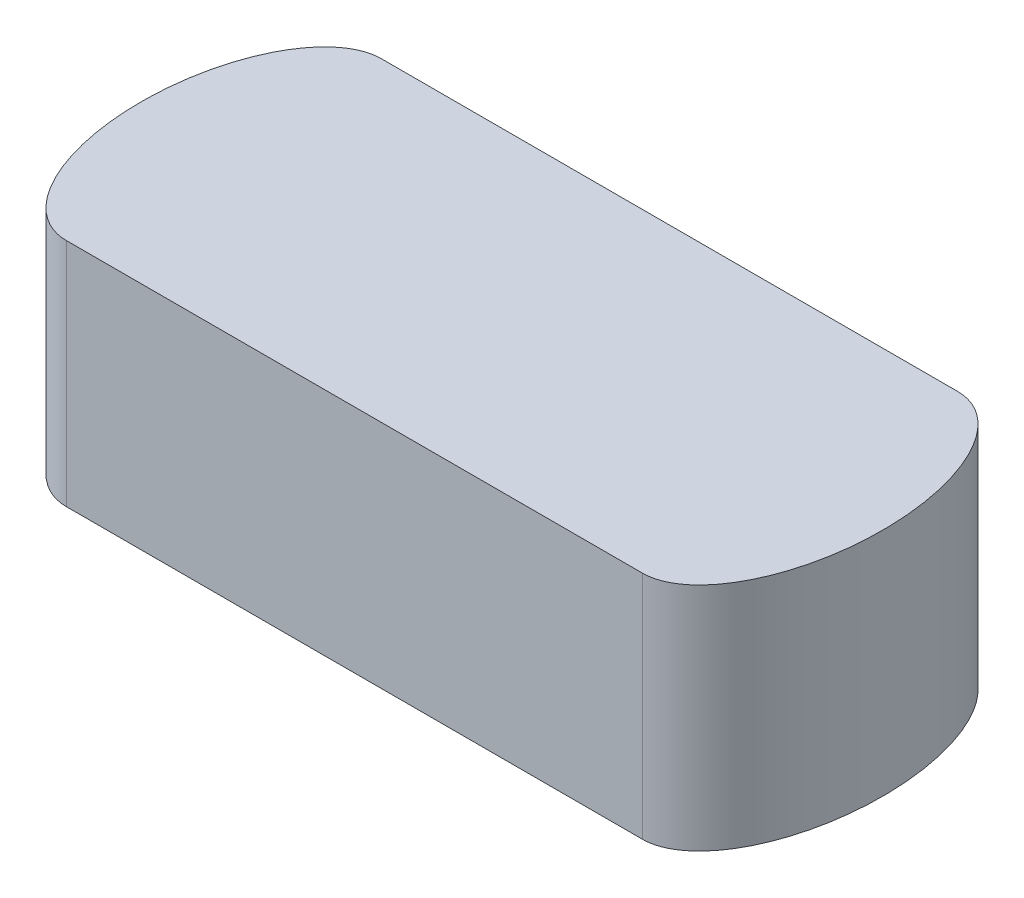
ISO-10303-21;
HEADER;
FILE_DESCRIPTION(('STEP AP214'),'2;1');
FILE_NAME('part.step','',(''),(''),'','','');
FILE_SCHEMA(('AUTOMOTIVE_DESIGN { 1 0 10303 214 1 1 1 1 }'));
ENDSEC;
DATA;
#1=APPLICATION_CONTEXT('core data for automotive mechanical design processes');
#2=APPLICATION_PROTOCOL_DEFINITION('international standard','automotive_design',2000,#1);
#3=PRODUCT_CONTEXT('',#1,'mechanical');
#4=PRODUCT('Part','Part','',(#3));
#5=PRODUCT_RELATED_PRODUCT_CATEGORY('part','',(#4));
#6=PRODUCT_DEFINITION_FORMATION('','',#4);
#7=PRODUCT_DEFINITION_CONTEXT('part definition',#1,'design');
#8=PRODUCT_DEFINITION('design','',#6,#7);
#9=PRODUCT_DEFINITION_SHAPE('','',#8);
#10=(LENGTH_UNIT() NAMED_UNIT(*) SI_UNIT(.MILLI.,.METRE.));
#11=(NAMED_UNIT(*) PLANE_ANGLE_UNIT() SI_UNIT($,.RADIAN.));
#12=(NAMED_UNIT(*) SI_UNIT($,.STERADIAN.) SOLID_ANGLE_UNIT());
#13=UNCERTAINTY_MEASURE_WITH_UNIT(LENGTH_MEASURE(1.E-05),#10,'distance_accuracy_value','');
#14=(GEOMETRIC_REPRESENTATION_CONTEXT(3) GLOBAL_UNCERTAINTY_ASSIGNED_CONTEXT((#13)) GLOBAL_UNIT_ASSIGNED_CONTEXT((#10,
#11,#12)) REPRESENTATION_CONTEXT('',''));
#15=CARTESIAN_POINT('',(0.,0.,0.));
#16=DIRECTION('',(0.,0.,1.));
#17=DIRECTION('',(1.,0.,0.));
#18=AXIS2_PLACEMENT_3D('',#15,#16,#17);
#19=CARTESIAN_POINT('',(-250.,200.,-136.655948553055));
#20=DIRECTION('',(0.,0.,1.));
#21=DIRECTION('',(1.,0.,0.));
#22=AXIS2_PLACEMENT_3D('',#19,#20,#21);
#23=PLANE('',#22);
#24=DIRECTION('',(-1.,0.,0.));
#25=VECTOR('',#24,1.);
#26=CARTESIAN_POINT('',(-250.,0.,-136.655948553055));
#27=LINE('',#26,#25);
#28=CARTESIAN_POINT('',(250.,0.,-136.655948553055));
#29=VERTEX_POINT('',#28);
#30=CARTESIAN_POINT('',(-250.,0.,-136.655948553055));
#31=VERTEX_POINT('',#30);
#32=EDGE_CURVE('E63',#29,#31,#27,.T.);
#33=ORIENTED_EDGE('',*,*,#32,.T.);
#34=DIRECTION('',(0.,-1.,0.));
#35=VECTOR('',#34,1.);
#36=CARTESIAN_POINT('',(-250.,200.,-136.655948553055));
#37=LINE('',#36,#35);
#38=CARTESIAN_POINT('',(-250.,200.,-136.655948553055));
#39=VERTEX_POINT('',#38);
#40=EDGE_CURVE('E11',#39,#31,#37,.T.);
#41=ORIENTED_EDGE('',*,*,#40,.F.);
#42=DIRECTION('',(-1.,0.,0.));
#43=VECTOR('',#42,1.);
#44=CARTESIAN_POINT('',(-250.,200.,-136.655948553055));
#45=LINE('',#44,#43);
#46=CARTESIAN_POINT('',(250.,200.,-136.655948553055));
#47=VERTEX_POINT('',#46);
#48=EDGE_CURVE('E68',#47,#39,#45,.T.);
#49=ORIENTED_EDGE('',*,*,#48,.F.);
#50=DIRECTION('',(0.,-1.,0.));
#51=VECTOR('',#50,1.);
#52=CARTESIAN_POINT('',(250.,200.,-136.655948553055));
#53=LINE('',#52,#51);
#54=EDGE_CURVE('E85',#47,#29,#53,.T.);
#55=ORIENTED_EDGE('',*,*,#54,.T.);
#56=EDGE_LOOP('',(#33,#41,#49,#55));
#57=FACE_BOUND('',#56,.T.);
#58=ADVANCED_FACE('F36',(#57),#23,.F.);
#59=CARTESIAN_POINT('',(-250.,200.,0.));
#60=DIRECTION('',(0.,1.,0.));
#61=DIRECTION('',(0.,0.,1.));
#62=AXIS2_PLACEMENT_3D('',#59,#60,#61);
#63=ELLIPSE('',#62,136.655948553055,71.859586268284);
#64=DIRECTION('',(0.,-1.,0.));
#65=VECTOR('',#64,1.);
#66=SURFACE_OF_LINEAR_EXTRUSION('',#63,#65);
#67=CARTESIAN_POINT('',(-250.,0.,0.));
#68=DIRECTION('',(0.,1.,0.));
#69=DIRECTION('',(0.,0.,1.));
#70=AXIS2_PLACEMENT_3D('',#67,#68,#69);
#71=ELLIPSE('',#70,136.655948553055,71.859586268284);
#72=CARTESIAN_POINT('',(-250.,0.,136.655948553055));
#73=VERTEX_POINT('',#72);
#74=EDGE_CURVE('E82',#31,#73,#71,.T.);
#75=ORIENTED_EDGE('',*,*,#74,.T.);
#76=DIRECTION('',(0.,-1.,0.));
#77=VECTOR('',#76,1.);
#78=CARTESIAN_POINT('',(-250.,200.,136.655948553055));
#79=LINE('',#78,#77);
#80=CARTESIAN_POINT('',(-250.,200.,136.655948553055));
#81=VERTEX_POINT('',#80);
#82=EDGE_CURVE('E44',#81,#73,#79,.T.);
#83=ORIENTED_EDGE('',*,*,#82,.F.);
#84=EDGE_CURVE('E52',#39,#81,#63,.T.);
#85=ORIENTED_EDGE('',*,*,#84,.F.);
#86=ORIENTED_EDGE('',*,*,#40,.T.);
#87=EDGE_LOOP('',(#75,#83,#85,#86));
#88=FACE_BOUND('',#87,.T.);
#89=ADVANCED_FACE('F104',(#88),#66,.F.);
#90=CARTESIAN_POINT('',(-250.,200.,136.655948553055));
#91=DIRECTION('',(0.,0.,-1.));
#92=DIRECTION('',(-1.,0.,0.));
#93=AXIS2_PLACEMENT_3D('',#90,#91,#92);
#94=PLANE('',#93);
#95=DIRECTION('',(1.,0.,0.));
#96=VECTOR('',#95,1.);
#97=CARTESIAN_POINT('',(-250.,0.,136.655948553055));
#98=LINE('',#97,#96);
#99=CARTESIAN_POINT('',(250.,0.,136.655948553055));
#100=VERTEX_POINT('',#99);
#101=EDGE_CURVE('E100',#73,#100,#98,.T.);
#102=ORIENTED_EDGE('',*,*,#101,.T.);
#103=DIRECTION('',(0.,-1.,0.));
#104=VECTOR('',#103,1.);
#105=CARTESIAN_POINT('',(250.,200.,136.655948553055));
#106=LINE('',#105,#104);
#107=CARTESIAN_POINT('',(250.,200.,136.655948553055));
#108=VERTEX_POINT('',#107);
#109=EDGE_CURVE('E83',#108,#100,#106,.T.);
#110=ORIENTED_EDGE('',*,*,#109,.F.);
#111=DIRECTION('',(1.,0.,0.));
#112=VECTOR('',#111,1.);
#113=CARTESIAN_POINT('',(-250.,200.,136.655948553055));
#114=LINE('',#113,#112);
#115=EDGE_CURVE('E103',#81,#108,#114,.T.);
#116=ORIENTED_EDGE('',*,*,#115,.F.);
#117=ORIENTED_EDGE('',*,*,#82,.T.);
#118=EDGE_LOOP('',(#102,#110,#116,#117));
#119=FACE_BOUND('',#118,.T.);
#120=ADVANCED_FACE('F107',(#119),#94,.F.);
#121=CARTESIAN_POINT('',(-250.,200.,0.));
#122=DIRECTION('',(0.,1.,0.));
#123=DIRECTION('',(0.,0.,1.));
#124=AXIS2_PLACEMENT_3D('',#121,#122,#123);
#125=PLANE('',#124);
#126=ORIENTED_EDGE('',*,*,#115,.T.);
#127=CARTESIAN_POINT('',(250.,200.,0.));
#128=DIRECTION('',(0.,-1.,0.));
#129=DIRECTION('',(0.,0.,1.));
#130=AXIS2_PLACEMENT_3D('',#127,#128,#129);
#131=ELLIPSE('',#130,136.655948553055,71.859586268284);
#132=EDGE_CURVE('E89',#47,#108,#131,.T.);
#133=ORIENTED_EDGE('',*,*,#132,.F.);
#134=ORIENTED_EDGE('',*,*,#48,.T.);
#135=ORIENTED_EDGE('',*,*,#84,.T.);
#136=EDGE_LOOP('',(#126,#133,#134,#135));
#137=FACE_BOUND('',#136,.T.);
#138=ADVANCED_FACE('F111',(#137),#125,.T.);
#139=CARTESIAN_POINT('',(-250.,0.,0.));
#140=DIRECTION('',(0.,1.,0.));
#141=DIRECTION('',(0.,0.,1.));
#142=AXIS2_PLACEMENT_3D('',#139,#140,#141);
#143=PLANE('',#142);
#144=ORIENTED_EDGE('',*,*,#32,.F.);
#145=CARTESIAN_POINT('',(250.,0.,0.));
#146=DIRECTION('',(0.,-1.,0.));
#147=DIRECTION('',(0.,0.,1.));
#148=AXIS2_PLACEMENT_3D('',#145,#146,#147);
#149=ELLIPSE('',#148,136.655948553055,71.859586268284);
#150=EDGE_CURVE('E81',#29,#100,#149,.T.);
#151=ORIENTED_EDGE('',*,*,#150,.T.);
#152=ORIENTED_EDGE('',*,*,#101,.F.);
#153=ORIENTED_EDGE('',*,*,#74,.F.);
#154=EDGE_LOOP('',(#144,#151,#152,#153));
#155=FACE_BOUND('',#154,.T.);
#156=ADVANCED_FACE('F78',(#155),#143,.F.);
#157=DIRECTION('',(0.,-1.,0.));
#158=VECTOR('',#157,1.);
#159=SURFACE_OF_LINEAR_EXTRUSION('',#131,#158);
#160=ORIENTED_EDGE('',*,*,#150,.F.);
#161=ORIENTED_EDGE('',*,*,#54,.F.);
#162=ORIENTED_EDGE('',*,*,#132,.T.);
#163=ORIENTED_EDGE('',*,*,#109,.T.);
#164=EDGE_LOOP('',(#160,#161,#162,#163));
#165=FACE_BOUND('',#164,.T.);
#166=ADVANCED_FACE('F92',(#165),#159,.T.);
#167=CLOSED_SHELL('',(#58,#89,#120,#138,#156,#166));
#168=MANIFOLD_SOLID_BREP('B2',#167);
#169=ADVANCED_BREP_SHAPE_REPRESENTATION('',(#18,#168),#14);
#170=SHAPE_DEFINITION_REPRESENTATION(#9,#169);
ENDSEC;
END-ISO-10303-21;
